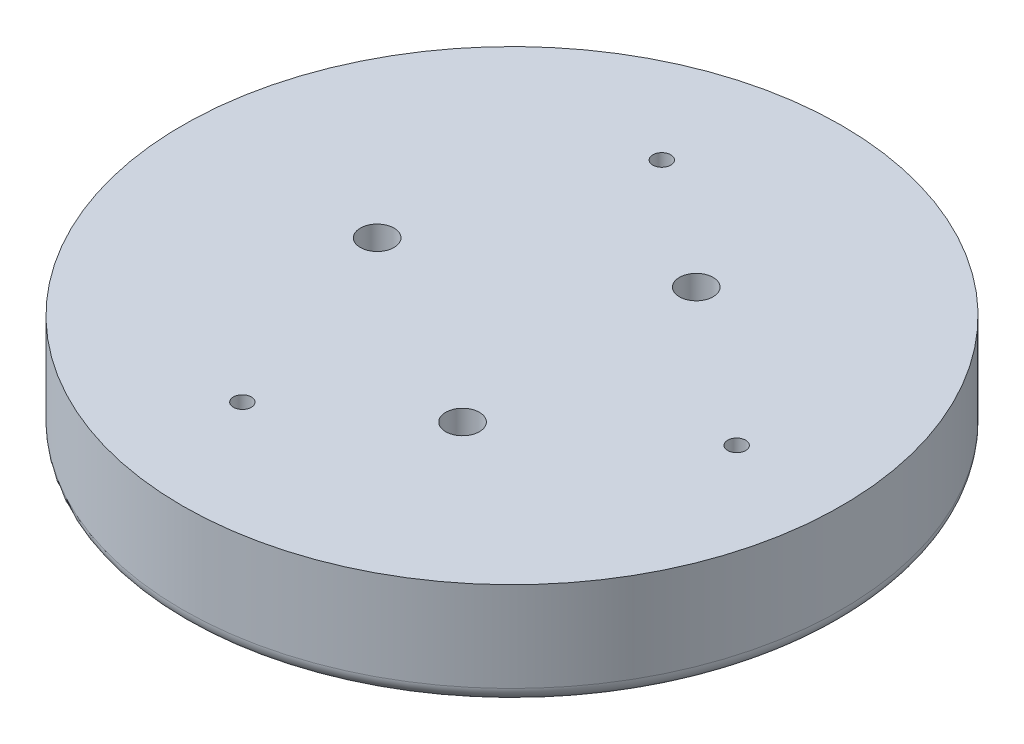
ISO-10303-21;
HEADER;
FILE_DESCRIPTION(('STEP AP214'),'2;1');
FILE_NAME('part.step','',(''),(''),'','','');
FILE_SCHEMA(('AUTOMOTIVE_DESIGN { 1 0 10303 214 1 1 1 1 }'));
ENDSEC;
DATA;
#1=APPLICATION_CONTEXT('core data for automotive mechanical design processes');
#2=APPLICATION_PROTOCOL_DEFINITION('international standard','automotive_design',2000,#1);
#3=PRODUCT_CONTEXT('',#1,'mechanical');
#4=PRODUCT('Part','Part','',(#3));
#5=PRODUCT_RELATED_PRODUCT_CATEGORY('part','',(#4));
#6=PRODUCT_DEFINITION_FORMATION('','',#4);
#7=PRODUCT_DEFINITION_CONTEXT('part definition',#1,'design');
#8=PRODUCT_DEFINITION('design','',#6,#7);
#9=PRODUCT_DEFINITION_SHAPE('','',#8);
#10=(LENGTH_UNIT() NAMED_UNIT(*) SI_UNIT(.MILLI.,.METRE.));
#11=(NAMED_UNIT(*) PLANE_ANGLE_UNIT() SI_UNIT($,.RADIAN.));
#12=(NAMED_UNIT(*) SI_UNIT($,.STERADIAN.) SOLID_ANGLE_UNIT());
#13=UNCERTAINTY_MEASURE_WITH_UNIT(LENGTH_MEASURE(1.E-05),#10,'distance_accuracy_value','');
#14=(GEOMETRIC_REPRESENTATION_CONTEXT(3) GLOBAL_UNCERTAINTY_ASSIGNED_CONTEXT((#13)) GLOBAL_UNIT_ASSIGNED_CONTEXT((#10,
#11,#12)) REPRESENTATION_CONTEXT('',''));
#15=CARTESIAN_POINT('',(0.,0.,0.));
#16=DIRECTION('',(0.,0.,1.));
#17=DIRECTION('',(1.,0.,0.));
#18=AXIS2_PLACEMENT_3D('',#15,#16,#17);
#19=CARTESIAN_POINT('',(0.,7.,0.));
#20=DIRECTION('',(0.,1.,0.));
#21=DIRECTION('',(0.,0.,1.));
#22=AXIS2_PLACEMENT_3D('',#19,#20,#21);
#23=PLANE('',#22);
#24=CARTESIAN_POINT('',(4.5,7.,-7.8));
#25=DIRECTION('',(0.,1.,0.));
#26=DIRECTION('',(0.,0.,1.));
#27=AXIS2_PLACEMENT_3D('',#24,#25,#26);
#28=CIRCLE('',#27,1.125);
#29=CARTESIAN_POINT('',(4.5,7.,-6.675));
#30=VERTEX_POINT('',#29);
#31=EDGE_CURVE('E72',#30,#30,#28,.T.);
#32=ORIENTED_EDGE('',*,*,#31,.F.);
#33=EDGE_LOOP('',(#32));
#34=FACE_BOUND('',#33,.T.);
#35=CARTESIAN_POINT('',(15.,7.,0.));
#36=DIRECTION('',(0.,1.,0.));
#37=DIRECTION('',(0.,0.,1.));
#38=AXIS2_PLACEMENT_3D('',#35,#36,#37);
#39=CIRCLE('',#38,0.6);
#40=CARTESIAN_POINT('',(15.,7.,0.6));
#41=VERTEX_POINT('',#40);
#42=EDGE_CURVE('E60',#41,#41,#39,.T.);
#43=ORIENTED_EDGE('',*,*,#42,.F.);
#44=EDGE_LOOP('',(#43));
#45=FACE_BOUND('',#44,.T.);
#46=CARTESIAN_POINT('',(-4.,7.,-14.));
#47=DIRECTION('',(0.,1.,0.));
#48=DIRECTION('',(0.,0.,1.));
#49=AXIS2_PLACEMENT_3D('',#46,#47,#48);
#50=CIRCLE('',#49,0.6);
#51=CARTESIAN_POINT('',(-4.,7.,-13.4));
#52=VERTEX_POINT('',#51);
#53=EDGE_CURVE('E48',#52,#52,#50,.T.);
#54=ORIENTED_EDGE('',*,*,#53,.F.);
#55=EDGE_LOOP('',(#54));
#56=FACE_BOUND('',#55,.T.);
#57=CARTESIAN_POINT('',(0.,7.,0.));
#58=DIRECTION('',(0.,1.,0.));
#59=DIRECTION('',(0.,0.,1.));
#60=AXIS2_PLACEMENT_3D('',#57,#58,#59);
#61=CIRCLE('',#60,22.);
#62=CARTESIAN_POINT('',(0.,7.,22.));
#63=VERTEX_POINT('',#62);
#64=EDGE_CURVE('E44',#63,#63,#61,.T.);
#65=ORIENTED_EDGE('',*,*,#64,.T.);
#66=EDGE_LOOP('',(#65));
#67=FACE_BOUND('',#66,.T.);
#68=CARTESIAN_POINT('',(-4.,7.,14.));
#69=DIRECTION('',(0.,1.,0.));
#70=DIRECTION('',(0.,0.,1.));
#71=AXIS2_PLACEMENT_3D('',#68,#69,#70);
#72=CIRCLE('',#71,0.6);
#73=CARTESIAN_POINT('',(-4.,7.,14.6));
#74=VERTEX_POINT('',#73);
#75=EDGE_CURVE('E54',#74,#74,#72,.T.);
#76=ORIENTED_EDGE('',*,*,#75,.F.);
#77=EDGE_LOOP('',(#76));
#78=FACE_BOUND('',#77,.T.);
#79=CARTESIAN_POINT('',(-9.,7.,0.));
#80=DIRECTION('',(0.,1.,0.));
#81=DIRECTION('',(0.,0.,1.));
#82=AXIS2_PLACEMENT_3D('',#79,#80,#81);
#83=CIRCLE('',#82,1.125);
#84=CARTESIAN_POINT('',(-9.,7.,1.125));
#85=VERTEX_POINT('',#84);
#86=EDGE_CURVE('E66',#85,#85,#83,.T.);
#87=ORIENTED_EDGE('',*,*,#86,.F.);
#88=EDGE_LOOP('',(#87));
#89=FACE_BOUND('',#88,.T.);
#90=CARTESIAN_POINT('',(4.5,7.,7.8));
#91=DIRECTION('',(0.,1.,0.));
#92=DIRECTION('',(0.,0.,1.));
#93=AXIS2_PLACEMENT_3D('',#90,#91,#92);
#94=CIRCLE('',#93,1.125);
#95=CARTESIAN_POINT('',(4.5,7.,8.925));
#96=VERTEX_POINT('',#95);
#97=EDGE_CURVE('E78',#96,#96,#94,.T.);
#98=ORIENTED_EDGE('',*,*,#97,.F.);
#99=EDGE_LOOP('',(#98));
#100=FACE_BOUND('',#99,.T.);
#101=ADVANCED_FACE('F33',(#34,#45,#56,#67,#78,#89,#100),#23,.T.);
#102=CARTESIAN_POINT('',(0.,0.,0.));
#103=DIRECTION('',(0.,1.,0.));
#104=DIRECTION('',(0.,0.,1.));
#105=AXIS2_PLACEMENT_3D('',#102,#103,#104);
#106=PLANE('',#105);
#107=CARTESIAN_POINT('',(0.,0.,0.));
#108=DIRECTION('',(0.,1.,0.));
#109=DIRECTION('',(0.,0.,1.));
#110=AXIS2_PLACEMENT_3D('',#107,#108,#109);
#111=CIRCLE('',#110,21.);
#112=CARTESIAN_POINT('',(0.,0.,21.));
#113=VERTEX_POINT('',#112);
#114=EDGE_CURVE('E10',#113,#113,#111,.F.);
#115=ORIENTED_EDGE('',*,*,#114,.T.);
#116=EDGE_LOOP('',(#115));
#117=FACE_BOUND('',#116,.T.);
#118=CARTESIAN_POINT('',(-4.,0.,-14.));
#119=DIRECTION('',(0.,1.,0.));
#120=DIRECTION('',(0.,0.,1.));
#121=AXIS2_PLACEMENT_3D('',#118,#119,#120);
#122=CIRCLE('',#121,0.6);
#123=CARTESIAN_POINT('',(-4.,0.,-13.4));
#124=VERTEX_POINT('',#123);
#125=EDGE_CURVE('E51',#124,#124,#122,.T.);
#126=ORIENTED_EDGE('',*,*,#125,.T.);
#127=EDGE_LOOP('',(#126));
#128=FACE_BOUND('',#127,.T.);
#129=CARTESIAN_POINT('',(-4.,0.,14.));
#130=DIRECTION('',(0.,1.,0.));
#131=DIRECTION('',(0.,0.,1.));
#132=AXIS2_PLACEMENT_3D('',#129,#130,#131);
#133=CIRCLE('',#132,0.6);
#134=CARTESIAN_POINT('',(-4.,0.,14.6));
#135=VERTEX_POINT('',#134);
#136=EDGE_CURVE('E57',#135,#135,#133,.T.);
#137=ORIENTED_EDGE('',*,*,#136,.T.);
#138=EDGE_LOOP('',(#137));
#139=FACE_BOUND('',#138,.T.);
#140=CARTESIAN_POINT('',(15.,0.,0.));
#141=DIRECTION('',(0.,1.,0.));
#142=DIRECTION('',(0.,0.,1.));
#143=AXIS2_PLACEMENT_3D('',#140,#141,#142);
#144=CIRCLE('',#143,0.6);
#145=CARTESIAN_POINT('',(15.,0.,0.6));
#146=VERTEX_POINT('',#145);
#147=EDGE_CURVE('E63',#146,#146,#144,.T.);
#148=ORIENTED_EDGE('',*,*,#147,.T.);
#149=EDGE_LOOP('',(#148));
#150=FACE_BOUND('',#149,.T.);
#151=CARTESIAN_POINT('',(-9.,0.,0.));
#152=DIRECTION('',(0.,1.,0.));
#153=DIRECTION('',(0.,0.,1.));
#154=AXIS2_PLACEMENT_3D('',#151,#152,#153);
#155=CIRCLE('',#154,1.125);
#156=CARTESIAN_POINT('',(-9.,0.,1.125));
#157=VERTEX_POINT('',#156);
#158=EDGE_CURVE('E69',#157,#157,#155,.T.);
#159=ORIENTED_EDGE('',*,*,#158,.T.);
#160=EDGE_LOOP('',(#159));
#161=FACE_BOUND('',#160,.T.);
#162=CARTESIAN_POINT('',(4.5,0.,-7.8));
#163=DIRECTION('',(0.,1.,0.));
#164=DIRECTION('',(0.,0.,1.));
#165=AXIS2_PLACEMENT_3D('',#162,#163,#164);
#166=CIRCLE('',#165,1.125);
#167=CARTESIAN_POINT('',(4.5,0.,-6.675));
#168=VERTEX_POINT('',#167);
#169=EDGE_CURVE('E75',#168,#168,#166,.T.);
#170=ORIENTED_EDGE('',*,*,#169,.T.);
#171=EDGE_LOOP('',(#170));
#172=FACE_BOUND('',#171,.T.);
#173=CARTESIAN_POINT('',(4.5,0.,7.8));
#174=DIRECTION('',(0.,1.,0.));
#175=DIRECTION('',(0.,0.,1.));
#176=AXIS2_PLACEMENT_3D('',#173,#174,#175);
#177=CIRCLE('',#176,1.125);
#178=CARTESIAN_POINT('',(4.5,0.,8.925));
#179=VERTEX_POINT('',#178);
#180=EDGE_CURVE('E81',#179,#179,#177,.T.);
#181=ORIENTED_EDGE('',*,*,#180,.T.);
#182=EDGE_LOOP('',(#181));
#183=FACE_BOUND('',#182,.T.);
#184=ADVANCED_FACE('F91',(#117,#128,#139,#150,#161,#172,#183),#106,.F.);
#185=CARTESIAN_POINT('',(0.,7.,0.));
#186=DIRECTION('',(0.,-1.,0.));
#187=DIRECTION('',(0.,0.,-1.));
#188=AXIS2_PLACEMENT_3D('',#185,#186,#187);
#189=CYLINDRICAL_SURFACE('',#188,22.);
#190=CARTESIAN_POINT('',(0.,1.,0.));
#191=DIRECTION('',(0.,1.,0.));
#192=DIRECTION('',(0.,0.,1.));
#193=AXIS2_PLACEMENT_3D('',#190,#191,#192);
#194=CIRCLE('',#193,22.);
#195=CARTESIAN_POINT('',(0.,1.,22.));
#196=VERTEX_POINT('',#195);
#197=EDGE_CURVE('E40',#196,#196,#194,.T.);
#198=ORIENTED_EDGE('',*,*,#197,.T.);
#199=EDGE_LOOP('',(#198));
#200=FACE_BOUND('',#199,.T.);
#201=ORIENTED_EDGE('',*,*,#64,.F.);
#202=EDGE_LOOP('',(#201));
#203=FACE_BOUND('',#202,.T.);
#204=ADVANCED_FACE('F97',(#200,#203),#189,.T.);
#205=CARTESIAN_POINT('',(-4.,7.,-14.));
#206=DIRECTION('',(0.,-1.,0.));
#207=DIRECTION('',(0.,0.,-1.));
#208=AXIS2_PLACEMENT_3D('',#205,#206,#207);
#209=CYLINDRICAL_SURFACE('',#208,0.6);
#210=ORIENTED_EDGE('',*,*,#53,.T.);
#211=EDGE_LOOP('',(#210));
#212=FACE_BOUND('',#211,.T.);
#213=ORIENTED_EDGE('',*,*,#125,.F.);
#214=EDGE_LOOP('',(#213));
#215=FACE_BOUND('',#214,.T.);
#216=ADVANCED_FACE('F102',(#212,#215),#209,.F.);
#217=CARTESIAN_POINT('',(-4.,7.,14.));
#218=DIRECTION('',(0.,-1.,0.));
#219=DIRECTION('',(0.,0.,-1.));
#220=AXIS2_PLACEMENT_3D('',#217,#218,#219);
#221=CYLINDRICAL_SURFACE('',#220,0.6);
#222=ORIENTED_EDGE('',*,*,#75,.T.);
#223=EDGE_LOOP('',(#222));
#224=FACE_BOUND('',#223,.T.);
#225=ORIENTED_EDGE('',*,*,#136,.F.);
#226=EDGE_LOOP('',(#225));
#227=FACE_BOUND('',#226,.T.);
#228=ADVANCED_FACE('F108',(#224,#227),#221,.F.);
#229=CARTESIAN_POINT('',(15.,7.,0.));
#230=DIRECTION('',(0.,-1.,0.));
#231=DIRECTION('',(0.,0.,-1.));
#232=AXIS2_PLACEMENT_3D('',#229,#230,#231);
#233=CYLINDRICAL_SURFACE('',#232,0.6);
#234=ORIENTED_EDGE('',*,*,#42,.T.);
#235=EDGE_LOOP('',(#234));
#236=FACE_BOUND('',#235,.T.);
#237=ORIENTED_EDGE('',*,*,#147,.F.);
#238=EDGE_LOOP('',(#237));
#239=FACE_BOUND('',#238,.T.);
#240=ADVANCED_FACE('F122',(#236,#239),#233,.F.);
#241=CARTESIAN_POINT('',(-9.,7.,0.));
#242=DIRECTION('',(0.,-1.,0.));
#243=DIRECTION('',(0.,0.,-1.));
#244=AXIS2_PLACEMENT_3D('',#241,#242,#243);
#245=CYLINDRICAL_SURFACE('',#244,1.125);
#246=ORIENTED_EDGE('',*,*,#86,.T.);
#247=EDGE_LOOP('',(#246));
#248=FACE_BOUND('',#247,.T.);
#249=ORIENTED_EDGE('',*,*,#158,.F.);
#250=EDGE_LOOP('',(#249));
#251=FACE_BOUND('',#250,.T.);
#252=ADVANCED_FACE('F118',(#248,#251),#245,.F.);
#253=CARTESIAN_POINT('',(4.5,7.,-7.8));
#254=DIRECTION('',(0.,-1.,0.));
#255=DIRECTION('',(0.,0.,-1.));
#256=AXIS2_PLACEMENT_3D('',#253,#254,#255);
#257=CYLINDRICAL_SURFACE('',#256,1.125);
#258=ORIENTED_EDGE('',*,*,#31,.T.);
#259=EDGE_LOOP('',(#258));
#260=FACE_BOUND('',#259,.T.);
#261=ORIENTED_EDGE('',*,*,#169,.F.);
#262=EDGE_LOOP('',(#261));
#263=FACE_BOUND('',#262,.T.);
#264=ADVANCED_FACE('F121',(#260,#263),#257,.F.);
#265=CARTESIAN_POINT('',(4.5,7.,7.8));
#266=DIRECTION('',(0.,-1.,0.));
#267=DIRECTION('',(0.,0.,-1.));
#268=AXIS2_PLACEMENT_3D('',#265,#266,#267);
#269=CYLINDRICAL_SURFACE('',#268,1.125);
#270=ORIENTED_EDGE('',*,*,#97,.T.);
#271=EDGE_LOOP('',(#270));
#272=FACE_BOUND('',#271,.T.);
#273=ORIENTED_EDGE('',*,*,#180,.F.);
#274=EDGE_LOOP('',(#273));
#275=FACE_BOUND('',#274,.T.);
#276=ADVANCED_FACE('F87',(#272,#275),#269,.F.);
#277=CARTESIAN_POINT('',(0.,1.,0.));
#278=DIRECTION('',(0.,1.,0.));
#279=DIRECTION('',(0.,0.,1.));
#280=AXIS2_PLACEMENT_3D('',#277,#278,#279);
#281=TOROIDAL_SURFACE('',#280,21.,1.);
#282=ORIENTED_EDGE('',*,*,#114,.F.);
#283=EDGE_LOOP('',(#282));
#284=FACE_BOUND('',#283,.T.);
#285=ORIENTED_EDGE('',*,*,#197,.F.);
#286=EDGE_LOOP('',(#285));
#287=FACE_BOUND('',#286,.T.);
#288=ADVANCED_FACE('F35',(#284,#287),#281,.T.);
#289=CLOSED_SHELL('',(#101,#184,#204,#216,#228,#240,#252,#264,#276,#288));
#290=MANIFOLD_SOLID_BREP('B2',#289);
#291=ADVANCED_BREP_SHAPE_REPRESENTATION('',(#18,#290),#14);
#292=SHAPE_DEFINITION_REPRESENTATION(#9,#291);
ENDSEC;
END-ISO-10303-21;
